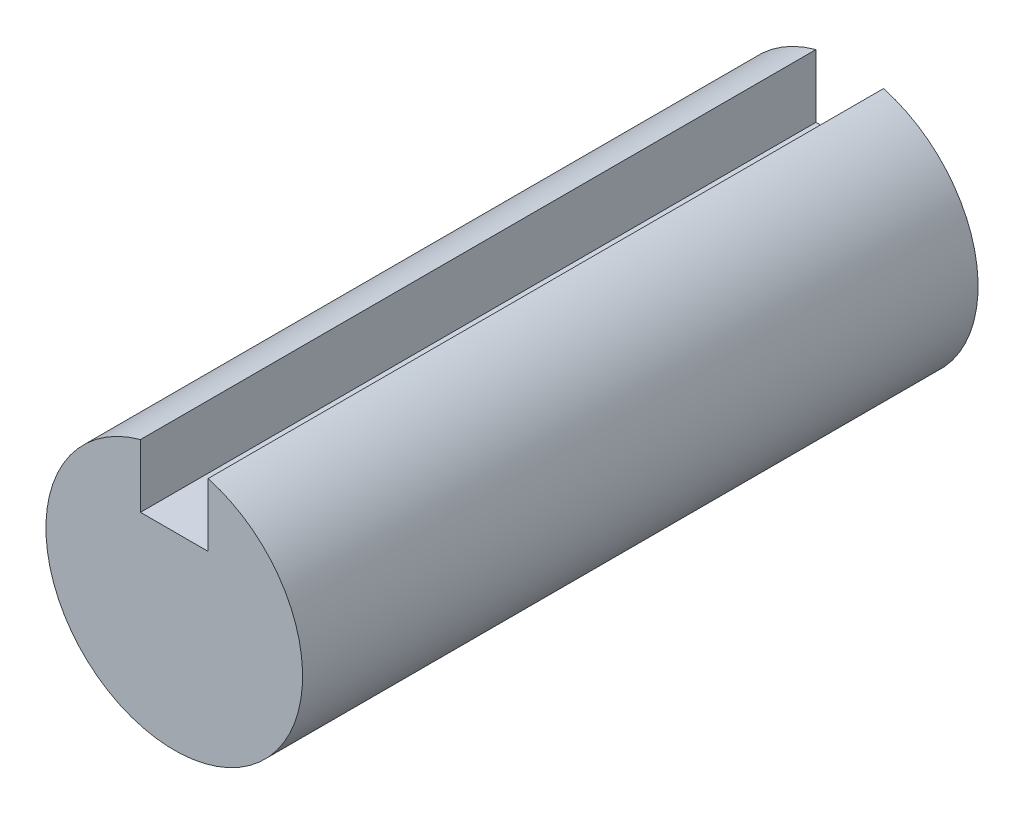
ISO-10303-21;
HEADER;
FILE_DESCRIPTION(('STEP AP214'),'2;1');
FILE_NAME('part.step','',(''),(''),'','','');
FILE_SCHEMA(('AUTOMOTIVE_DESIGN { 1 0 10303 214 1 1 1 1 }'));
ENDSEC;
DATA;
#1=APPLICATION_CONTEXT('core data for automotive mechanical design processes');
#2=APPLICATION_PROTOCOL_DEFINITION('international standard','automotive_design',2000,#1);
#3=PRODUCT_CONTEXT('',#1,'mechanical');
#4=PRODUCT('Part','Part','',(#3));
#5=PRODUCT_RELATED_PRODUCT_CATEGORY('part','',(#4));
#6=PRODUCT_DEFINITION_FORMATION('','',#4);
#7=PRODUCT_DEFINITION_CONTEXT('part definition',#1,'design');
#8=PRODUCT_DEFINITION('design','',#6,#7);
#9=PRODUCT_DEFINITION_SHAPE('','',#8);
#10=(LENGTH_UNIT() NAMED_UNIT(*) SI_UNIT(.MILLI.,.METRE.));
#11=(NAMED_UNIT(*) PLANE_ANGLE_UNIT() SI_UNIT($,.RADIAN.));
#12=(NAMED_UNIT(*) SI_UNIT($,.STERADIAN.) SOLID_ANGLE_UNIT());
#13=UNCERTAINTY_MEASURE_WITH_UNIT(LENGTH_MEASURE(1.E-05),#10,'distance_accuracy_value','');
#14=(GEOMETRIC_REPRESENTATION_CONTEXT(3) GLOBAL_UNCERTAINTY_ASSIGNED_CONTEXT((#13)) GLOBAL_UNIT_ASSIGNED_CONTEXT((#10,
#11,#12)) REPRESENTATION_CONTEXT('',''));
#15=CARTESIAN_POINT('',(0.,0.,0.));
#16=DIRECTION('',(0.,0.,1.));
#17=DIRECTION('',(1.,0.,0.));
#18=AXIS2_PLACEMENT_3D('',#15,#16,#17);
#19=CARTESIAN_POINT('',(0.,0.,50.));
#20=DIRECTION('',(0.,0.,-1.));
#21=DIRECTION('',(-1.,0.,0.));
#22=AXIS2_PLACEMENT_3D('',#19,#20,#21);
#23=CYLINDRICAL_SURFACE('',#22,9.5);
#24=CARTESIAN_POINT('',(0.,0.,50.));
#25=DIRECTION('',(0.,0.,1.));
#26=DIRECTION('',(1.,0.,0.));
#27=AXIS2_PLACEMENT_3D('',#24,#25,#26);
#28=CIRCLE('',#27,9.5);
#29=CARTESIAN_POINT('',(-2.5,9.16515138991168,50.));
#30=VERTEX_POINT('',#29);
#31=CARTESIAN_POINT('',(2.5,9.16515138991168,50.));
#32=VERTEX_POINT('',#31);
#33=EDGE_CURVE('E46',#30,#32,#28,.T.);
#34=ORIENTED_EDGE('',*,*,#33,.F.);
#35=DIRECTION('',(0.,0.,-1.));
#36=VECTOR('',#35,1.);
#37=CARTESIAN_POINT('',(-2.5,9.16515138991168,50.));
#38=LINE('',#37,#36);
#39=CARTESIAN_POINT('',(-2.5,9.16515138991168,0.));
#40=VERTEX_POINT('',#39);
#41=EDGE_CURVE('E97',#30,#40,#38,.T.);
#42=ORIENTED_EDGE('',*,*,#41,.T.);
#43=CARTESIAN_POINT('',(0.,0.,0.));
#44=DIRECTION('',(0.,0.,1.));
#45=DIRECTION('',(1.,0.,0.));
#46=AXIS2_PLACEMENT_3D('',#43,#44,#45);
#47=CIRCLE('',#46,9.5);
#48=CARTESIAN_POINT('',(2.5,9.16515138991168,0.));
#49=VERTEX_POINT('',#48);
#50=EDGE_CURVE('E94',#40,#49,#47,.T.);
#51=ORIENTED_EDGE('',*,*,#50,.T.);
#52=DIRECTION('',(0.,0.,-1.));
#53=VECTOR('',#52,1.);
#54=CARTESIAN_POINT('',(2.5,9.16515138991168,50.));
#55=LINE('',#54,#53);
#56=EDGE_CURVE('E100',#49,#32,#55,.F.);
#57=ORIENTED_EDGE('',*,*,#56,.T.);
#58=EDGE_LOOP('',(#34,#42,#51,#57));
#59=FACE_BOUND('',#58,.T.);
#60=ADVANCED_FACE('F39',(#59),#23,.T.);
#61=CARTESIAN_POINT('',(0.,0.,50.));
#62=DIRECTION('',(0.,0.,1.));
#63=DIRECTION('',(1.,0.,0.));
#64=AXIS2_PLACEMENT_3D('',#61,#62,#63);
#65=PLANE('',#64);
#66=DIRECTION('',(0.,-1.,0.));
#67=VECTOR('',#66,1.);
#68=CARTESIAN_POINT('',(-2.5,14.5,50.));
#69=LINE('',#68,#67);
#70=CARTESIAN_POINT('',(-2.5,4.5,50.));
#71=VERTEX_POINT('',#70);
#72=EDGE_CURVE('E79',#30,#71,#69,.T.);
#73=ORIENTED_EDGE('',*,*,#72,.F.);
#74=ORIENTED_EDGE('',*,*,#33,.T.);
#75=DIRECTION('',(0.,1.,0.));
#76=VECTOR('',#75,1.);
#77=CARTESIAN_POINT('',(2.5,14.5,50.));
#78=LINE('',#77,#76);
#79=CARTESIAN_POINT('',(2.5,4.5,50.));
#80=VERTEX_POINT('',#79);
#81=EDGE_CURVE('E89',#80,#32,#78,.T.);
#82=ORIENTED_EDGE('',*,*,#81,.F.);
#83=DIRECTION('',(1.,0.,0.));
#84=VECTOR('',#83,1.);
#85=CARTESIAN_POINT('',(2.5,4.5,50.));
#86=LINE('',#85,#84);
#87=EDGE_CURVE('E106',#71,#80,#86,.T.);
#88=ORIENTED_EDGE('',*,*,#87,.F.);
#89=EDGE_LOOP('',(#73,#74,#82,#88));
#90=FACE_BOUND('',#89,.T.);
#91=ADVANCED_FACE('F111',(#90),#65,.T.);
#92=CARTESIAN_POINT('',(0.,0.,0.));
#93=DIRECTION('',(0.,0.,1.));
#94=DIRECTION('',(1.,0.,0.));
#95=AXIS2_PLACEMENT_3D('',#92,#93,#94);
#96=PLANE('',#95);
#97=ORIENTED_EDGE('',*,*,#50,.F.);
#98=DIRECTION('',(0.,-1.,0.));
#99=VECTOR('',#98,1.);
#100=CARTESIAN_POINT('',(-2.5,0.,0.));
#101=LINE('',#100,#99);
#102=CARTESIAN_POINT('',(-2.5,4.5,0.));
#103=VERTEX_POINT('',#102);
#104=EDGE_CURVE('E11',#40,#103,#101,.T.);
#105=ORIENTED_EDGE('',*,*,#104,.T.);
#106=DIRECTION('',(1.,0.,0.));
#107=VECTOR('',#106,1.);
#108=CARTESIAN_POINT('',(2.5,4.5,0.));
#109=LINE('',#108,#107);
#110=CARTESIAN_POINT('',(2.5,4.5,0.));
#111=VERTEX_POINT('',#110);
#112=EDGE_CURVE('E86',#103,#111,#109,.T.);
#113=ORIENTED_EDGE('',*,*,#112,.T.);
#114=DIRECTION('',(0.,1.,0.));
#115=VECTOR('',#114,1.);
#116=CARTESIAN_POINT('',(2.5,14.5,0.));
#117=LINE('',#116,#115);
#118=EDGE_CURVE('E53',#111,#49,#117,.T.);
#119=ORIENTED_EDGE('',*,*,#118,.T.);
#120=EDGE_LOOP('',(#97,#105,#113,#119));
#121=FACE_BOUND('',#120,.T.);
#122=ADVANCED_FACE('F92',(#121),#96,.F.);
#123=CARTESIAN_POINT('',(-2.5,14.5,0.));
#124=DIRECTION('',(-1.,0.,0.));
#125=DIRECTION('',(0.,-1.,0.));
#126=AXIS2_PLACEMENT_3D('',#123,#124,#125);
#127=PLANE('',#126);
#128=ORIENTED_EDGE('',*,*,#72,.T.);
#129=DIRECTION('',(0.,0.,1.));
#130=VECTOR('',#129,1.);
#131=CARTESIAN_POINT('',(-2.5,4.5,0.));
#132=LINE('',#131,#130);
#133=EDGE_CURVE('E75',#103,#71,#132,.T.);
#134=ORIENTED_EDGE('',*,*,#133,.F.);
#135=ORIENTED_EDGE('',*,*,#104,.F.);
#136=ORIENTED_EDGE('',*,*,#41,.F.);
#137=EDGE_LOOP('',(#128,#134,#135,#136));
#138=FACE_BOUND('',#137,.T.);
#139=ADVANCED_FACE('F77',(#138),#127,.F.);
#140=CARTESIAN_POINT('',(2.5,14.5,0.));
#141=DIRECTION('',(1.,0.,0.));
#142=DIRECTION('',(0.,1.,0.));
#143=AXIS2_PLACEMENT_3D('',#140,#141,#142);
#144=PLANE('',#143);
#145=ORIENTED_EDGE('',*,*,#118,.F.);
#146=DIRECTION('',(0.,0.,1.));
#147=VECTOR('',#146,1.);
#148=CARTESIAN_POINT('',(2.5,4.5,0.));
#149=LINE('',#148,#147);
#150=EDGE_CURVE('E83',#111,#80,#149,.T.);
#151=ORIENTED_EDGE('',*,*,#150,.T.);
#152=ORIENTED_EDGE('',*,*,#81,.T.);
#153=ORIENTED_EDGE('',*,*,#56,.F.);
#154=EDGE_LOOP('',(#145,#151,#152,#153));
#155=FACE_BOUND('',#154,.T.);
#156=ADVANCED_FACE('F113',(#155),#144,.F.);
#157=CARTESIAN_POINT('',(2.5,4.5,0.));
#158=DIRECTION('',(0.,-1.,0.));
#159=DIRECTION('',(1.,0.,0.));
#160=AXIS2_PLACEMENT_3D('',#157,#158,#159);
#161=PLANE('',#160);
#162=ORIENTED_EDGE('',*,*,#87,.T.);
#163=ORIENTED_EDGE('',*,*,#150,.F.);
#164=ORIENTED_EDGE('',*,*,#112,.F.);
#165=ORIENTED_EDGE('',*,*,#133,.T.);
#166=EDGE_LOOP('',(#162,#163,#164,#165));
#167=FACE_BOUND('',#166,.T.);
#168=ADVANCED_FACE('F87',(#167),#161,.F.);
#169=CLOSED_SHELL('',(#60,#91,#122,#139,#156,#168));
#170=MANIFOLD_SOLID_BREP('B2',#169);
#171=ADVANCED_BREP_SHAPE_REPRESENTATION('',(#18,#170),#14);
#172=SHAPE_DEFINITION_REPRESENTATION(#9,#171);
ENDSEC;
END-ISO-10303-21;
